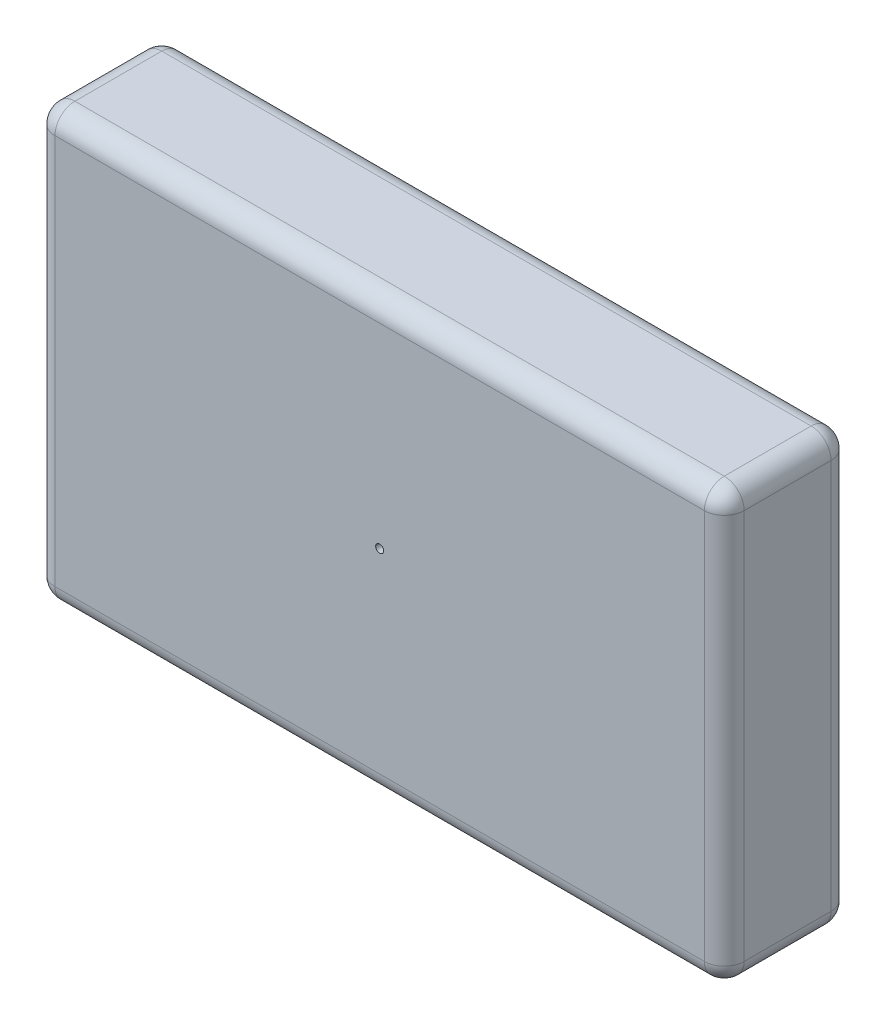
ISO-10303-21;
HEADER;
FILE_DESCRIPTION(('STEP AP214'),'2;1');
FILE_NAME('part.step','',(''),(''),'','','');
FILE_SCHEMA(('AUTOMOTIVE_DESIGN { 1 0 10303 214 1 1 1 1 }'));
ENDSEC;
DATA;
#1=APPLICATION_CONTEXT('core data for automotive mechanical design processes');
#2=APPLICATION_PROTOCOL_DEFINITION('international standard','automotive_design',2000,#1);
#3=PRODUCT_CONTEXT('',#1,'mechanical');
#4=PRODUCT('Part','Part','',(#3));
#5=PRODUCT_RELATED_PRODUCT_CATEGORY('part','',(#4));
#6=PRODUCT_DEFINITION_FORMATION('','',#4);
#7=PRODUCT_DEFINITION_CONTEXT('part definition',#1,'design');
#8=PRODUCT_DEFINITION('design','',#6,#7);
#9=PRODUCT_DEFINITION_SHAPE('','',#8);
#10=(LENGTH_UNIT() NAMED_UNIT(*) SI_UNIT(.MILLI.,.METRE.));
#11=(NAMED_UNIT(*) PLANE_ANGLE_UNIT() SI_UNIT($,.RADIAN.));
#12=(NAMED_UNIT(*) SI_UNIT($,.STERADIAN.) SOLID_ANGLE_UNIT());
#13=UNCERTAINTY_MEASURE_WITH_UNIT(LENGTH_MEASURE(1.E-05),#10,'distance_accuracy_value','');
#14=(GEOMETRIC_REPRESENTATION_CONTEXT(3) GLOBAL_UNCERTAINTY_ASSIGNED_CONTEXT((#13)) GLOBAL_UNIT_ASSIGNED_CONTEXT((#10,
#11,#12)) REPRESENTATION_CONTEXT('',''));
#15=CARTESIAN_POINT('',(0.,0.,0.));
#16=DIRECTION('',(0.,0.,1.));
#17=DIRECTION('',(1.,0.,0.));
#18=AXIS2_PLACEMENT_3D('',#15,#16,#17);
#19=CARTESIAN_POINT('',(0.,0.,21.8));
#20=DIRECTION('',(0.,0.,1.));
#21=DIRECTION('',(1.,0.,0.));
#22=AXIS2_PLACEMENT_3D('',#19,#20,#21);
#23=PLANE('',#22);
#24=CARTESIAN_POINT('',(0.,0.,21.8));
#25=DIRECTION('',(0.,0.,1.));
#26=DIRECTION('',(1.,0.,0.));
#27=AXIS2_PLACEMENT_3D('',#24,#25,#26);
#28=CIRCLE('',#27,1.);
#29=CARTESIAN_POINT('',(1.,0.,21.8));
#30=VERTEX_POINT('',#29);
#31=CARTESIAN_POINT('',(-1.,0.,21.8));
#32=VERTEX_POINT('',#31);
#33=EDGE_CURVE('E11',#30,#32,#28,.T.);
#34=ORIENTED_EDGE('',*,*,#33,.T.);
#35=CARTESIAN_POINT('',(0.,0.,21.8));
#36=DIRECTION('',(0.,0.,1.));
#37=DIRECTION('',(1.,0.,0.));
#38=AXIS2_PLACEMENT_3D('',#35,#36,#37);
#39=CIRCLE('',#38,1.);
#40=EDGE_CURVE('E381',#32,#30,#39,.T.);
#41=ORIENTED_EDGE('',*,*,#40,.T.);
#42=EDGE_LOOP('',(#34,#41));
#43=FACE_BOUND('',#42,.T.);
#44=ADVANCED_FACE('F17',(#43),#23,.T.);
#45=CARTESIAN_POINT('',(0.,0.,21.8));
#46=DIRECTION('',(0.,0.,1.));
#47=DIRECTION('',(1.,0.,0.));
#48=AXIS2_PLACEMENT_3D('',#45,#46,#47);
#49=CYLINDRICAL_SURFACE('',#48,1.);
#50=DIRECTION('',(0.,0.,1.));
#51=VECTOR('',#50,1.);
#52=CARTESIAN_POINT('',(-1.,0.,21.8));
#53=LINE('',#52,#51);
#54=CARTESIAN_POINT('',(-1.,0.,31.8));
#55=VERTEX_POINT('',#54);
#56=EDGE_CURVE('E379',#32,#55,#53,.T.);
#57=ORIENTED_EDGE('',*,*,#56,.F.);
#58=ORIENTED_EDGE('',*,*,#33,.F.);
#59=DIRECTION('',(0.,0.,1.));
#60=VECTOR('',#59,1.);
#61=CARTESIAN_POINT('',(1.,0.,21.8));
#62=LINE('',#61,#60);
#63=CARTESIAN_POINT('',(1.,0.,31.8));
#64=VERTEX_POINT('',#63);
#65=EDGE_CURVE('E350',#30,#64,#62,.T.);
#66=ORIENTED_EDGE('',*,*,#65,.T.);
#67=CARTESIAN_POINT('',(0.,0.,31.8));
#68=DIRECTION('',(0.,0.,1.));
#69=DIRECTION('',(1.,0.,0.));
#70=AXIS2_PLACEMENT_3D('',#67,#68,#69);
#71=CIRCLE('',#70,1.);
#72=EDGE_CURVE('E135',#64,#55,#71,.T.);
#73=ORIENTED_EDGE('',*,*,#72,.T.);
#74=EDGE_LOOP('',(#57,#58,#66,#73));
#75=FACE_BOUND('',#74,.T.);
#76=ADVANCED_FACE('F464',(#75),#49,.F.);
#77=CARTESIAN_POINT('',(81.5,49.,26.8));
#78=DIRECTION('',(0.,1.,0.));
#79=DIRECTION('',(1.,0.,0.));
#80=AXIS2_PLACEMENT_3D('',#77,#78,#79);
#81=SPHERICAL_SURFACE('',#80,5.);
#82=CARTESIAN_POINT('',(81.5,49.,26.8));
#83=DIRECTION('',(0.,0.,1.));
#84=DIRECTION('',(1.,0.,0.));
#85=AXIS2_PLACEMENT_3D('',#82,#83,#84);
#86=CIRCLE('',#85,5.);
#87=CARTESIAN_POINT('',(86.5,49.,26.8));
#88=VERTEX_POINT('',#87);
#89=CARTESIAN_POINT('',(81.5,54.,26.8));
#90=VERTEX_POINT('',#89);
#91=EDGE_CURVE('E20',#88,#90,#86,.T.);
#92=ORIENTED_EDGE('',*,*,#91,.T.);
#93=CARTESIAN_POINT('',(81.5,49.,26.8));
#94=DIRECTION('',(-1.,0.,0.));
#95=DIRECTION('',(0.,0.,-1.));
#96=AXIS2_PLACEMENT_3D('',#93,#94,#95);
#97=CIRCLE('',#96,5.);
#98=CARTESIAN_POINT('',(81.5,49.,31.8));
#99=VERTEX_POINT('',#98);
#100=EDGE_CURVE('E154',#99,#90,#97,.T.);
#101=ORIENTED_EDGE('',*,*,#100,.F.);
#102=CARTESIAN_POINT('',(81.5,49.,26.8));
#103=DIRECTION('',(0.,-1.,0.));
#104=DIRECTION('',(0.,0.,-1.));
#105=AXIS2_PLACEMENT_3D('',#102,#103,#104);
#106=CIRCLE('',#105,5.);
#107=EDGE_CURVE('E170',#88,#99,#106,.T.);
#108=ORIENTED_EDGE('',*,*,#107,.F.);
#109=EDGE_LOOP('',(#92,#101,#108));
#110=FACE_BOUND('',#109,.T.);
#111=ADVANCED_FACE('F231',(#110),#81,.T.);
#112=CARTESIAN_POINT('',(81.5,49.,31.8));
#113=DIRECTION('',(0.,0.,-1.));
#114=DIRECTION('',(-1.,0.,0.));
#115=AXIS2_PLACEMENT_3D('',#112,#113,#114);
#116=CYLINDRICAL_SURFACE('',#115,5.);
#117=CARTESIAN_POINT('',(81.5,49.,5.));
#118=DIRECTION('',(0.,0.,1.));
#119=DIRECTION('',(1.,0.,0.));
#120=AXIS2_PLACEMENT_3D('',#117,#118,#119);
#121=CIRCLE('',#120,5.);
#122=CARTESIAN_POINT('',(86.5,49.,5.));
#123=VERTEX_POINT('',#122);
#124=CARTESIAN_POINT('',(81.5,54.,5.));
#125=VERTEX_POINT('',#124);
#126=EDGE_CURVE('E211',#123,#125,#121,.T.);
#127=ORIENTED_EDGE('',*,*,#126,.T.);
#128=DIRECTION('',(0.,0.,-1.));
#129=VECTOR('',#128,1.);
#130=CARTESIAN_POINT('',(81.5,54.,31.8));
#131=LINE('',#130,#129);
#132=EDGE_CURVE('E248',#90,#125,#131,.T.);
#133=ORIENTED_EDGE('',*,*,#132,.F.);
#134=ORIENTED_EDGE('',*,*,#91,.F.);
#135=DIRECTION('',(0.,0.,1.));
#136=VECTOR('',#135,1.);
#137=CARTESIAN_POINT('',(86.5,49.,31.8));
#138=LINE('',#137,#136);
#139=EDGE_CURVE('E269',#123,#88,#138,.T.);
#140=ORIENTED_EDGE('',*,*,#139,.F.);
#141=EDGE_LOOP('',(#127,#133,#134,#140));
#142=FACE_BOUND('',#141,.T.);
#143=ADVANCED_FACE('F249',(#142),#116,.T.);
#144=CARTESIAN_POINT('',(81.5,49.,5.));
#145=DIRECTION('',(0.,1.,0.));
#146=DIRECTION('',(1.,0.,0.));
#147=AXIS2_PLACEMENT_3D('',#144,#145,#146);
#148=SPHERICAL_SURFACE('',#147,5.);
#149=CARTESIAN_POINT('',(81.5,49.,5.));
#150=DIRECTION('',(0.,-1.,0.));
#151=DIRECTION('',(0.,0.,1.));
#152=AXIS2_PLACEMENT_3D('',#149,#150,#151);
#153=CIRCLE('',#152,5.);
#154=CARTESIAN_POINT('',(81.5,49.,0.));
#155=VERTEX_POINT('',#154);
#156=EDGE_CURVE('E105',#155,#123,#153,.T.);
#157=ORIENTED_EDGE('',*,*,#156,.F.);
#158=CARTESIAN_POINT('',(81.5,49.,5.));
#159=DIRECTION('',(-1.,0.,0.));
#160=DIRECTION('',(0.,0.,1.));
#161=AXIS2_PLACEMENT_3D('',#158,#159,#160);
#162=CIRCLE('',#161,5.);
#163=EDGE_CURVE('E53',#125,#155,#162,.T.);
#164=ORIENTED_EDGE('',*,*,#163,.F.);
#165=ORIENTED_EDGE('',*,*,#126,.F.);
#166=EDGE_LOOP('',(#157,#164,#165));
#167=FACE_BOUND('',#166,.T.);
#168=ADVANCED_FACE('F489',(#167),#148,.T.);
#169=CARTESIAN_POINT('',(-81.5,49.,26.8));
#170=DIRECTION('',(0.,1.,0.));
#171=DIRECTION('',(1.,0.,0.));
#172=AXIS2_PLACEMENT_3D('',#169,#170,#171);
#173=SPHERICAL_SURFACE('',#172,5.);
#174=CARTESIAN_POINT('',(-81.5,49.,26.8));
#175=DIRECTION('',(0.,-1.,0.));
#176=DIRECTION('',(-1.,0.,0.));
#177=AXIS2_PLACEMENT_3D('',#174,#175,#176);
#178=CIRCLE('',#177,5.);
#179=CARTESIAN_POINT('',(-81.5,49.,31.8));
#180=VERTEX_POINT('',#179);
#181=CARTESIAN_POINT('',(-86.5,49.,26.8));
#182=VERTEX_POINT('',#181);
#183=EDGE_CURVE('E162',#180,#182,#178,.T.);
#184=ORIENTED_EDGE('',*,*,#183,.F.);
#185=CARTESIAN_POINT('',(-81.5,49.,26.8));
#186=DIRECTION('',(1.,0.,0.));
#187=DIRECTION('',(0.,0.,-1.));
#188=AXIS2_PLACEMENT_3D('',#185,#186,#187);
#189=CIRCLE('',#188,5.);
#190=CARTESIAN_POINT('',(-81.5,54.,26.8));
#191=VERTEX_POINT('',#190);
#192=EDGE_CURVE('E128',#191,#180,#189,.T.);
#193=ORIENTED_EDGE('',*,*,#192,.F.);
#194=CARTESIAN_POINT('',(-81.5,49.,26.8));
#195=DIRECTION('',(0.,0.,1.));
#196=DIRECTION('',(1.,0.,0.));
#197=AXIS2_PLACEMENT_3D('',#194,#195,#196);
#198=CIRCLE('',#197,5.);
#199=EDGE_CURVE('E208',#191,#182,#198,.T.);
#200=ORIENTED_EDGE('',*,*,#199,.T.);
#201=EDGE_LOOP('',(#184,#193,#200));
#202=FACE_BOUND('',#201,.T.);
#203=ADVANCED_FACE('F486',(#202),#173,.T.);
#204=CARTESIAN_POINT('',(-81.5,49.,31.8));
#205=DIRECTION('',(0.,0.,-1.));
#206=DIRECTION('',(-1.,0.,0.));
#207=AXIS2_PLACEMENT_3D('',#204,#205,#206);
#208=CYLINDRICAL_SURFACE('',#207,5.);
#209=CARTESIAN_POINT('',(-81.5,49.,5.));
#210=DIRECTION('',(0.,0.,1.));
#211=DIRECTION('',(1.,0.,0.));
#212=AXIS2_PLACEMENT_3D('',#209,#210,#211);
#213=CIRCLE('',#212,5.);
#214=CARTESIAN_POINT('',(-81.5,54.,5.));
#215=VERTEX_POINT('',#214);
#216=CARTESIAN_POINT('',(-86.5,49.,5.));
#217=VERTEX_POINT('',#216);
#218=EDGE_CURVE('E204',#215,#217,#213,.T.);
#219=ORIENTED_EDGE('',*,*,#218,.T.);
#220=DIRECTION('',(0.,0.,-1.));
#221=VECTOR('',#220,1.);
#222=CARTESIAN_POINT('',(-86.5,49.,31.8));
#223=LINE('',#222,#221);
#224=EDGE_CURVE('E280',#182,#217,#223,.T.);
#225=ORIENTED_EDGE('',*,*,#224,.F.);
#226=ORIENTED_EDGE('',*,*,#199,.F.);
#227=DIRECTION('',(0.,0.,1.));
#228=VECTOR('',#227,1.);
#229=CARTESIAN_POINT('',(-81.5,54.,31.8));
#230=LINE('',#229,#228);
#231=EDGE_CURVE('E257',#215,#191,#230,.T.);
#232=ORIENTED_EDGE('',*,*,#231,.F.);
#233=EDGE_LOOP('',(#219,#225,#226,#232));
#234=FACE_BOUND('',#233,.T.);
#235=ADVANCED_FACE('F482',(#234),#208,.T.);
#236=CARTESIAN_POINT('',(-81.5,49.,5.));
#237=DIRECTION('',(0.,1.,0.));
#238=DIRECTION('',(1.,0.,0.));
#239=AXIS2_PLACEMENT_3D('',#236,#237,#238);
#240=SPHERICAL_SURFACE('',#239,5.);
#241=CARTESIAN_POINT('',(-81.5,49.,5.));
#242=DIRECTION('',(1.,0.,0.));
#243=DIRECTION('',(0.,0.,1.));
#244=AXIS2_PLACEMENT_3D('',#241,#242,#243);
#245=CIRCLE('',#244,5.);
#246=CARTESIAN_POINT('',(-81.5,49.,0.));
#247=VERTEX_POINT('',#246);
#248=EDGE_CURVE('E186',#247,#215,#245,.T.);
#249=ORIENTED_EDGE('',*,*,#248,.F.);
#250=CARTESIAN_POINT('',(-81.5,49.,5.));
#251=DIRECTION('',(0.,-1.,0.));
#252=DIRECTION('',(1.,0.,0.));
#253=AXIS2_PLACEMENT_3D('',#250,#251,#252);
#254=CIRCLE('',#253,5.);
#255=EDGE_CURVE('E104',#217,#247,#254,.T.);
#256=ORIENTED_EDGE('',*,*,#255,.F.);
#257=ORIENTED_EDGE('',*,*,#218,.F.);
#258=EDGE_LOOP('',(#249,#256,#257));
#259=FACE_BOUND('',#258,.T.);
#260=ADVANCED_FACE('F479',(#259),#240,.T.);
#261=CARTESIAN_POINT('',(81.5,-49.,26.8));
#262=DIRECTION('',(0.,1.,0.));
#263=DIRECTION('',(1.,0.,0.));
#264=AXIS2_PLACEMENT_3D('',#261,#262,#263);
#265=SPHERICAL_SURFACE('',#264,5.);
#266=CARTESIAN_POINT('',(81.5,-49.,26.8));
#267=DIRECTION('',(0.,0.,1.));
#268=DIRECTION('',(1.,0.,0.));
#269=AXIS2_PLACEMENT_3D('',#266,#267,#268);
#270=CIRCLE('',#269,5.);
#271=CARTESIAN_POINT('',(81.5,-54.,26.8));
#272=VERTEX_POINT('',#271);
#273=CARTESIAN_POINT('',(86.5,-49.,26.8));
#274=VERTEX_POINT('',#273);
#275=EDGE_CURVE('E200',#272,#274,#270,.T.);
#276=ORIENTED_EDGE('',*,*,#275,.T.);
#277=CARTESIAN_POINT('',(81.5,-49.,26.8));
#278=DIRECTION('',(0.,1.,0.));
#279=DIRECTION('',(0.,0.,-1.));
#280=AXIS2_PLACEMENT_3D('',#277,#278,#279);
#281=CIRCLE('',#280,5.);
#282=CARTESIAN_POINT('',(81.5,-49.,31.8));
#283=VERTEX_POINT('',#282);
#284=EDGE_CURVE('E166',#283,#274,#281,.T.);
#285=ORIENTED_EDGE('',*,*,#284,.F.);
#286=CARTESIAN_POINT('',(81.5,-49.,26.8));
#287=DIRECTION('',(-1.,0.,0.));
#288=DIRECTION('',(0.,0.,1.));
#289=AXIS2_PLACEMENT_3D('',#286,#287,#288);
#290=CIRCLE('',#289,5.);
#291=EDGE_CURVE('E119',#272,#283,#290,.T.);
#292=ORIENTED_EDGE('',*,*,#291,.F.);
#293=EDGE_LOOP('',(#276,#285,#292));
#294=FACE_BOUND('',#293,.T.);
#295=ADVANCED_FACE('F334',(#294),#265,.T.);
#296=CARTESIAN_POINT('',(81.5,-49.,31.8));
#297=DIRECTION('',(0.,0.,-1.));
#298=DIRECTION('',(-1.,0.,0.));
#299=AXIS2_PLACEMENT_3D('',#296,#297,#298);
#300=CYLINDRICAL_SURFACE('',#299,5.);
#301=CARTESIAN_POINT('',(81.5,-49.,5.));
#302=DIRECTION('',(0.,0.,1.));
#303=DIRECTION('',(1.,0.,0.));
#304=AXIS2_PLACEMENT_3D('',#301,#302,#303);
#305=CIRCLE('',#304,5.);
#306=CARTESIAN_POINT('',(81.5,-54.,5.));
#307=VERTEX_POINT('',#306);
#308=CARTESIAN_POINT('',(86.5,-49.,5.));
#309=VERTEX_POINT('',#308);
#310=EDGE_CURVE('E196',#307,#309,#305,.T.);
#311=ORIENTED_EDGE('',*,*,#310,.T.);
#312=DIRECTION('',(0.,0.,-1.));
#313=VECTOR('',#312,1.);
#314=CARTESIAN_POINT('',(86.5,-49.,31.8));
#315=LINE('',#314,#313);
#316=EDGE_CURVE('E349',#274,#309,#315,.T.);
#317=ORIENTED_EDGE('',*,*,#316,.F.);
#318=ORIENTED_EDGE('',*,*,#275,.F.);
#319=DIRECTION('',(0.,0.,1.));
#320=VECTOR('',#319,1.);
#321=CARTESIAN_POINT('',(81.5,-54.,31.8));
#322=LINE('',#321,#320);
#323=EDGE_CURVE('E295',#307,#272,#322,.T.);
#324=ORIENTED_EDGE('',*,*,#323,.F.);
#325=EDGE_LOOP('',(#311,#317,#318,#324));
#326=FACE_BOUND('',#325,.T.);
#327=ADVANCED_FACE('F446',(#326),#300,.T.);
#328=CARTESIAN_POINT('',(81.5,-49.,5.));
#329=DIRECTION('',(0.,1.,0.));
#330=DIRECTION('',(1.,0.,0.));
#331=AXIS2_PLACEMENT_3D('',#328,#329,#330);
#332=SPHERICAL_SURFACE('',#331,5.);
#333=CARTESIAN_POINT('',(81.5,-49.,5.));
#334=DIRECTION('',(-1.,0.,0.));
#335=DIRECTION('',(0.,0.,-1.));
#336=AXIS2_PLACEMENT_3D('',#333,#334,#335);
#337=CIRCLE('',#336,5.);
#338=CARTESIAN_POINT('',(81.5,-49.,0.));
#339=VERTEX_POINT('',#338);
#340=EDGE_CURVE('E118',#339,#307,#337,.T.);
#341=ORIENTED_EDGE('',*,*,#340,.F.);
#342=CARTESIAN_POINT('',(81.5,-49.,5.));
#343=DIRECTION('',(0.,1.,0.));
#344=DIRECTION('',(0.,0.,1.));
#345=AXIS2_PLACEMENT_3D('',#342,#343,#344);
#346=CIRCLE('',#345,5.);
#347=EDGE_CURVE('E39',#309,#339,#346,.T.);
#348=ORIENTED_EDGE('',*,*,#347,.F.);
#349=ORIENTED_EDGE('',*,*,#310,.F.);
#350=EDGE_LOOP('',(#341,#348,#349));
#351=FACE_BOUND('',#350,.T.);
#352=ADVANCED_FACE('F448',(#351),#332,.T.);
#353=CARTESIAN_POINT('',(-81.5,-49.,26.8));
#354=DIRECTION('',(0.,1.,0.));
#355=DIRECTION('',(1.,0.,0.));
#356=AXIS2_PLACEMENT_3D('',#353,#354,#355);
#357=SPHERICAL_SURFACE('',#356,5.);
#358=CARTESIAN_POINT('',(-81.5,-49.,26.8));
#359=DIRECTION('',(1.,0.,0.));
#360=DIRECTION('',(0.,0.,1.));
#361=AXIS2_PLACEMENT_3D('',#358,#359,#360);
#362=CIRCLE('',#361,5.);
#363=CARTESIAN_POINT('',(-81.5,-49.,31.8));
#364=VERTEX_POINT('',#363);
#365=CARTESIAN_POINT('',(-81.5,-54.,26.8));
#366=VERTEX_POINT('',#365);
#367=EDGE_CURVE('E173',#364,#366,#362,.T.);
#368=ORIENTED_EDGE('',*,*,#367,.F.);
#369=CARTESIAN_POINT('',(-81.5,-49.,26.8));
#370=DIRECTION('',(0.,1.,0.));
#371=DIRECTION('',(-1.,0.,0.));
#372=AXIS2_PLACEMENT_3D('',#369,#370,#371);
#373=CIRCLE('',#372,5.);
#374=CARTESIAN_POINT('',(-86.5,-49.,26.8));
#375=VERTEX_POINT('',#374);
#376=EDGE_CURVE('E158',#375,#364,#373,.T.);
#377=ORIENTED_EDGE('',*,*,#376,.F.);
#378=CARTESIAN_POINT('',(-81.5,-49.,26.8));
#379=DIRECTION('',(0.,0.,1.));
#380=DIRECTION('',(1.,0.,0.));
#381=AXIS2_PLACEMENT_3D('',#378,#379,#380);
#382=CIRCLE('',#381,5.);
#383=EDGE_CURVE('E192',#375,#366,#382,.T.);
#384=ORIENTED_EDGE('',*,*,#383,.T.);
#385=EDGE_LOOP('',(#368,#377,#384));
#386=FACE_BOUND('',#385,.T.);
#387=ADVANCED_FACE('F441',(#386),#357,.T.);
#388=CARTESIAN_POINT('',(-81.5,-49.,31.8));
#389=DIRECTION('',(0.,0.,-1.));
#390=DIRECTION('',(-1.,0.,0.));
#391=AXIS2_PLACEMENT_3D('',#388,#389,#390);
#392=CYLINDRICAL_SURFACE('',#391,5.);
#393=CARTESIAN_POINT('',(-81.5,-49.,5.));
#394=DIRECTION('',(0.,0.,1.));
#395=DIRECTION('',(1.,0.,0.));
#396=AXIS2_PLACEMENT_3D('',#393,#394,#395);
#397=CIRCLE('',#396,5.);
#398=CARTESIAN_POINT('',(-86.5,-49.,5.));
#399=VERTEX_POINT('',#398);
#400=CARTESIAN_POINT('',(-81.5,-54.,5.));
#401=VERTEX_POINT('',#400);
#402=EDGE_CURVE('E98',#399,#401,#397,.T.);
#403=ORIENTED_EDGE('',*,*,#402,.T.);
#404=DIRECTION('',(0.,0.,-1.));
#405=VECTOR('',#404,1.);
#406=CARTESIAN_POINT('',(-81.5,-54.,31.8));
#407=LINE('',#406,#405);
#408=EDGE_CURVE('E288',#366,#401,#407,.T.);
#409=ORIENTED_EDGE('',*,*,#408,.F.);
#410=ORIENTED_EDGE('',*,*,#383,.F.);
#411=DIRECTION('',(0.,0.,1.));
#412=VECTOR('',#411,1.);
#413=CARTESIAN_POINT('',(-86.5,-49.,31.8));
#414=LINE('',#413,#412);
#415=EDGE_CURVE('E273',#399,#375,#414,.T.);
#416=ORIENTED_EDGE('',*,*,#415,.F.);
#417=EDGE_LOOP('',(#403,#409,#410,#416));
#418=FACE_BOUND('',#417,.T.);
#419=ADVANCED_FACE('F443',(#418),#392,.T.);
#420=CARTESIAN_POINT('',(-81.5,-49.,5.));
#421=DIRECTION('',(0.,1.,0.));
#422=DIRECTION('',(1.,0.,0.));
#423=AXIS2_PLACEMENT_3D('',#420,#421,#422);
#424=SPHERICAL_SURFACE('',#423,5.);
#425=CARTESIAN_POINT('',(-81.5,-49.,5.));
#426=DIRECTION('',(0.,1.,0.));
#427=DIRECTION('',(1.,0.,0.));
#428=AXIS2_PLACEMENT_3D('',#425,#426,#427);
#429=CIRCLE('',#428,5.);
#430=CARTESIAN_POINT('',(-81.5,-49.,0.));
#431=VERTEX_POINT('',#430);
#432=EDGE_CURVE('E92',#431,#399,#429,.T.);
#433=ORIENTED_EDGE('',*,*,#432,.F.);
#434=CARTESIAN_POINT('',(-81.5,-49.,5.));
#435=DIRECTION('',(1.,0.,0.));
#436=DIRECTION('',(0.,0.,-1.));
#437=AXIS2_PLACEMENT_3D('',#434,#435,#436);
#438=CIRCLE('',#437,5.);
#439=EDGE_CURVE('E95',#401,#431,#438,.T.);
#440=ORIENTED_EDGE('',*,*,#439,.F.);
#441=ORIENTED_EDGE('',*,*,#402,.F.);
#442=EDGE_LOOP('',(#433,#440,#441));
#443=FACE_BOUND('',#442,.T.);
#444=ADVANCED_FACE('F94',(#443),#424,.T.);
#445=CARTESIAN_POINT('',(-86.5,49.,5.));
#446=DIRECTION('',(-1.,0.,0.));
#447=DIRECTION('',(0.,0.,1.));
#448=AXIS2_PLACEMENT_3D('',#445,#446,#447);
#449=CYLINDRICAL_SURFACE('',#448,5.);
#450=DIRECTION('',(1.,0.,0.));
#451=VECTOR('',#450,1.);
#452=CARTESIAN_POINT('',(0.,49.,0.));
#453=LINE('',#452,#451);
#454=EDGE_CURVE('E134',#247,#155,#453,.T.);
#455=ORIENTED_EDGE('',*,*,#454,.F.);
#456=ORIENTED_EDGE('',*,*,#248,.T.);
#457=DIRECTION('',(-1.,0.,0.));
#458=VECTOR('',#457,1.);
#459=CARTESIAN_POINT('',(-86.5,54.,5.));
#460=LINE('',#459,#458);
#461=EDGE_CURVE('E265',#125,#215,#460,.T.);
#462=ORIENTED_EDGE('',*,*,#461,.F.);
#463=ORIENTED_EDGE('',*,*,#163,.T.);
#464=EDGE_LOOP('',(#455,#456,#462,#463));
#465=FACE_BOUND('',#464,.T.);
#466=ADVANCED_FACE('F497',(#465),#449,.T.);
#467=CARTESIAN_POINT('',(-81.5,54.,5.));
#468=DIRECTION('',(0.,-1.,0.));
#469=DIRECTION('',(1.,0.,0.));
#470=AXIS2_PLACEMENT_3D('',#467,#468,#469);
#471=CYLINDRICAL_SURFACE('',#470,5.);
#472=DIRECTION('',(0.,1.,0.));
#473=VECTOR('',#472,1.);
#474=CARTESIAN_POINT('',(-81.5,0.,0.));
#475=LINE('',#474,#473);
#476=EDGE_CURVE('E125',#431,#247,#475,.T.);
#477=ORIENTED_EDGE('',*,*,#476,.F.);
#478=ORIENTED_EDGE('',*,*,#432,.T.);
#479=DIRECTION('',(0.,-1.,0.));
#480=VECTOR('',#479,1.);
#481=CARTESIAN_POINT('',(-86.5,54.,5.));
#482=LINE('',#481,#480);
#483=EDGE_CURVE('E253',#217,#399,#482,.T.);
#484=ORIENTED_EDGE('',*,*,#483,.F.);
#485=ORIENTED_EDGE('',*,*,#255,.T.);
#486=EDGE_LOOP('',(#477,#478,#484,#485));
#487=FACE_BOUND('',#486,.T.);
#488=ADVANCED_FACE('F131',(#487),#471,.T.);
#489=CARTESIAN_POINT('',(81.5,54.,5.));
#490=DIRECTION('',(0.,1.,0.));
#491=DIRECTION('',(0.,0.,1.));
#492=AXIS2_PLACEMENT_3D('',#489,#490,#491);
#493=CYLINDRICAL_SURFACE('',#492,5.);
#494=DIRECTION('',(0.,1.,0.));
#495=VECTOR('',#494,1.);
#496=CARTESIAN_POINT('',(86.5,54.,5.));
#497=LINE('',#496,#495);
#498=EDGE_CURVE('E356',#309,#123,#497,.T.);
#499=ORIENTED_EDGE('',*,*,#498,.F.);
#500=ORIENTED_EDGE('',*,*,#347,.T.);
#501=DIRECTION('',(0.,-1.,0.));
#502=VECTOR('',#501,1.);
#503=CARTESIAN_POINT('',(81.5,0.,0.));
#504=LINE('',#503,#502);
#505=EDGE_CURVE('E126',#155,#339,#504,.T.);
#506=ORIENTED_EDGE('',*,*,#505,.F.);
#507=ORIENTED_EDGE('',*,*,#156,.T.);
#508=EDGE_LOOP('',(#499,#500,#506,#507));
#509=FACE_BOUND('',#508,.T.);
#510=ADVANCED_FACE('F449',(#509),#493,.T.);
#511=CARTESIAN_POINT('',(-86.5,-49.,5.));
#512=DIRECTION('',(1.,0.,0.));
#513=DIRECTION('',(0.,0.,-1.));
#514=AXIS2_PLACEMENT_3D('',#511,#512,#513);
#515=CYLINDRICAL_SURFACE('',#514,5.);
#516=DIRECTION('',(1.,0.,0.));
#517=VECTOR('',#516,1.);
#518=CARTESIAN_POINT('',(-86.5,-54.,5.));
#519=LINE('',#518,#517);
#520=EDGE_CURVE('E115',#401,#307,#519,.T.);
#521=ORIENTED_EDGE('',*,*,#520,.F.);
#522=ORIENTED_EDGE('',*,*,#439,.T.);
#523=DIRECTION('',(-1.,0.,0.));
#524=VECTOR('',#523,1.);
#525=CARTESIAN_POINT('',(0.,-49.,0.));
#526=LINE('',#525,#524);
#527=EDGE_CURVE('E112',#339,#431,#526,.T.);
#528=ORIENTED_EDGE('',*,*,#527,.F.);
#529=ORIENTED_EDGE('',*,*,#340,.T.);
#530=EDGE_LOOP('',(#521,#522,#528,#529));
#531=FACE_BOUND('',#530,.T.);
#532=ADVANCED_FACE('F110',(#531),#515,.T.);
#533=CARTESIAN_POINT('',(0.,-49.,26.8));
#534=DIRECTION('',(-1.,0.,0.));
#535=DIRECTION('',(0.,0.,1.));
#536=AXIS2_PLACEMENT_3D('',#533,#534,#535);
#537=CYLINDRICAL_SURFACE('',#536,5.);
#538=DIRECTION('',(1.,0.,0.));
#539=VECTOR('',#538,1.);
#540=CARTESIAN_POINT('',(86.5,-49.,31.8));
#541=LINE('',#540,#539);
#542=EDGE_CURVE('E303',#364,#283,#541,.T.);
#543=ORIENTED_EDGE('',*,*,#542,.F.);
#544=ORIENTED_EDGE('',*,*,#367,.T.);
#545=DIRECTION('',(-1.,0.,0.));
#546=VECTOR('',#545,1.);
#547=CARTESIAN_POINT('',(-86.5,-54.,26.8));
#548=LINE('',#547,#546);
#549=EDGE_CURVE('E284',#272,#366,#548,.T.);
#550=ORIENTED_EDGE('',*,*,#549,.F.);
#551=ORIENTED_EDGE('',*,*,#291,.T.);
#552=EDGE_LOOP('',(#543,#544,#550,#551));
#553=FACE_BOUND('',#552,.T.);
#554=ADVANCED_FACE('F327',(#553),#537,.T.);
#555=CARTESIAN_POINT('',(81.5,0.,26.8));
#556=DIRECTION('',(0.,-1.,0.));
#557=DIRECTION('',(0.,0.,-1.));
#558=AXIS2_PLACEMENT_3D('',#555,#556,#557);
#559=CYLINDRICAL_SURFACE('',#558,5.);
#560=DIRECTION('',(0.,1.,0.));
#561=VECTOR('',#560,1.);
#562=CARTESIAN_POINT('',(81.5,54.,31.8));
#563=LINE('',#562,#561);
#564=EDGE_CURVE('E306',#283,#99,#563,.T.);
#565=ORIENTED_EDGE('',*,*,#564,.F.);
#566=ORIENTED_EDGE('',*,*,#284,.T.);
#567=DIRECTION('',(0.,-1.,0.));
#568=VECTOR('',#567,1.);
#569=CARTESIAN_POINT('',(86.5,-54.,26.8));
#570=LINE('',#569,#568);
#571=EDGE_CURVE('E342',#88,#274,#570,.T.);
#572=ORIENTED_EDGE('',*,*,#571,.F.);
#573=ORIENTED_EDGE('',*,*,#107,.T.);
#574=EDGE_LOOP('',(#565,#566,#572,#573));
#575=FACE_BOUND('',#574,.T.);
#576=ADVANCED_FACE('F340',(#575),#559,.T.);
#577=CARTESIAN_POINT('',(-81.5,0.,26.8));
#578=DIRECTION('',(0.,1.,0.));
#579=DIRECTION('',(-1.,0.,0.));
#580=AXIS2_PLACEMENT_3D('',#577,#578,#579);
#581=CYLINDRICAL_SURFACE('',#580,5.);
#582=DIRECTION('',(0.,1.,0.));
#583=VECTOR('',#582,1.);
#584=CARTESIAN_POINT('',(-86.5,54.,26.8));
#585=LINE('',#584,#583);
#586=EDGE_CURVE('E276',#375,#182,#585,.T.);
#587=ORIENTED_EDGE('',*,*,#586,.F.);
#588=ORIENTED_EDGE('',*,*,#376,.T.);
#589=DIRECTION('',(0.,-1.,0.));
#590=VECTOR('',#589,1.);
#591=CARTESIAN_POINT('',(-81.5,-54.,31.8));
#592=LINE('',#591,#590);
#593=EDGE_CURVE('E299',#180,#364,#592,.T.);
#594=ORIENTED_EDGE('',*,*,#593,.F.);
#595=ORIENTED_EDGE('',*,*,#183,.T.);
#596=EDGE_LOOP('',(#587,#588,#594,#595));
#597=FACE_BOUND('',#596,.T.);
#598=ADVANCED_FACE('F318',(#597),#581,.T.);
#599=CARTESIAN_POINT('',(0.,49.,26.8));
#600=DIRECTION('',(1.,0.,0.));
#601=DIRECTION('',(0.,0.,-1.));
#602=AXIS2_PLACEMENT_3D('',#599,#600,#601);
#603=CYLINDRICAL_SURFACE('',#602,5.);
#604=DIRECTION('',(1.,0.,0.));
#605=VECTOR('',#604,1.);
#606=CARTESIAN_POINT('',(86.5,54.,26.8));
#607=LINE('',#606,#605);
#608=EDGE_CURVE('E243',#191,#90,#607,.T.);
#609=ORIENTED_EDGE('',*,*,#608,.F.);
#610=ORIENTED_EDGE('',*,*,#192,.T.);
#611=DIRECTION('',(-1.,0.,0.));
#612=VECTOR('',#611,1.);
#613=CARTESIAN_POINT('',(-86.5,49.,31.8));
#614=LINE('',#613,#612);
#615=EDGE_CURVE('E145',#99,#180,#614,.T.);
#616=ORIENTED_EDGE('',*,*,#615,.F.);
#617=ORIENTED_EDGE('',*,*,#100,.T.);
#618=EDGE_LOOP('',(#609,#610,#616,#617));
#619=FACE_BOUND('',#618,.T.);
#620=ADVANCED_FACE('F241',(#619),#603,.T.);
#621=CARTESIAN_POINT('',(0.,0.,0.));
#622=DIRECTION('',(0.,0.,1.));
#623=DIRECTION('',(1.,0.,0.));
#624=AXIS2_PLACEMENT_3D('',#621,#622,#623);
#625=PLANE('',#624);
#626=ORIENTED_EDGE('',*,*,#476,.T.);
#627=ORIENTED_EDGE('',*,*,#454,.T.);
#628=ORIENTED_EDGE('',*,*,#505,.T.);
#629=ORIENTED_EDGE('',*,*,#527,.T.);
#630=EDGE_LOOP('',(#626,#627,#628,#629));
#631=FACE_BOUND('',#630,.T.);
#632=ADVANCED_FACE('F123',(#631),#625,.F.);
#633=CARTESIAN_POINT('',(0.,0.,31.8));
#634=DIRECTION('',(0.,0.,1.));
#635=DIRECTION('',(1.,0.,0.));
#636=AXIS2_PLACEMENT_3D('',#633,#634,#635);
#637=PLANE('',#636);
#638=ORIENTED_EDGE('',*,*,#72,.F.);
#639=CARTESIAN_POINT('',(0.,0.,31.8));
#640=DIRECTION('',(0.,0.,1.));
#641=DIRECTION('',(1.,0.,0.));
#642=AXIS2_PLACEMENT_3D('',#639,#640,#641);
#643=CIRCLE('',#642,1.);
#644=EDGE_CURVE('E360',#55,#64,#643,.T.);
#645=ORIENTED_EDGE('',*,*,#644,.F.);
#646=EDGE_LOOP('',(#638,#645));
#647=FACE_BOUND('',#646,.T.);
#648=ORIENTED_EDGE('',*,*,#593,.T.);
#649=ORIENTED_EDGE('',*,*,#542,.T.);
#650=ORIENTED_EDGE('',*,*,#564,.T.);
#651=ORIENTED_EDGE('',*,*,#615,.T.);
#652=EDGE_LOOP('',(#648,#649,#650,#651));
#653=FACE_BOUND('',#652,.T.);
#654=ADVANCED_FACE('F315',(#647,#653),#637,.T.);
#655=CARTESIAN_POINT('',(-86.5,-54.,31.8));
#656=DIRECTION('',(0.,1.,0.));
#657=DIRECTION('',(1.,0.,0.));
#658=AXIS2_PLACEMENT_3D('',#655,#656,#657);
#659=PLANE('',#658);
#660=ORIENTED_EDGE('',*,*,#549,.T.);
#661=ORIENTED_EDGE('',*,*,#408,.T.);
#662=ORIENTED_EDGE('',*,*,#520,.T.);
#663=ORIENTED_EDGE('',*,*,#323,.T.);
#664=EDGE_LOOP('',(#660,#661,#662,#663));
#665=FACE_BOUND('',#664,.T.);
#666=ADVANCED_FACE('F445',(#665),#659,.F.);
#667=CARTESIAN_POINT('',(-86.5,54.,31.8));
#668=DIRECTION('',(1.,0.,0.));
#669=DIRECTION('',(0.,1.,0.));
#670=AXIS2_PLACEMENT_3D('',#667,#668,#669);
#671=PLANE('',#670);
#672=ORIENTED_EDGE('',*,*,#483,.T.);
#673=ORIENTED_EDGE('',*,*,#415,.T.);
#674=ORIENTED_EDGE('',*,*,#586,.T.);
#675=ORIENTED_EDGE('',*,*,#224,.T.);
#676=EDGE_LOOP('',(#672,#673,#674,#675));
#677=FACE_BOUND('',#676,.T.);
#678=ADVANCED_FACE('F459',(#677),#671,.F.);
#679=CARTESIAN_POINT('',(-86.5,54.,31.8));
#680=DIRECTION('',(0.,-1.,0.));
#681=DIRECTION('',(0.,0.,-1.));
#682=AXIS2_PLACEMENT_3D('',#679,#680,#681);
#683=PLANE('',#682);
#684=ORIENTED_EDGE('',*,*,#461,.T.);
#685=ORIENTED_EDGE('',*,*,#231,.T.);
#686=ORIENTED_EDGE('',*,*,#608,.T.);
#687=ORIENTED_EDGE('',*,*,#132,.T.);
#688=EDGE_LOOP('',(#684,#685,#686,#687));
#689=FACE_BOUND('',#688,.T.);
#690=ADVANCED_FACE('F255',(#689),#683,.F.);
#691=CARTESIAN_POINT('',(86.5,54.,31.8));
#692=DIRECTION('',(-1.,0.,0.));
#693=DIRECTION('',(0.,0.,1.));
#694=AXIS2_PLACEMENT_3D('',#691,#692,#693);
#695=PLANE('',#694);
#696=ORIENTED_EDGE('',*,*,#571,.T.);
#697=ORIENTED_EDGE('',*,*,#316,.T.);
#698=ORIENTED_EDGE('',*,*,#498,.T.);
#699=ORIENTED_EDGE('',*,*,#139,.T.);
#700=EDGE_LOOP('',(#696,#697,#698,#699));
#701=FACE_BOUND('',#700,.T.);
#702=ADVANCED_FACE('F450',(#701),#695,.F.);
#703=CARTESIAN_POINT('',(0.,0.,21.8));
#704=DIRECTION('',(0.,0.,1.));
#705=DIRECTION('',(1.,0.,0.));
#706=AXIS2_PLACEMENT_3D('',#703,#704,#705);
#707=CYLINDRICAL_SURFACE('',#706,1.);
#708=ORIENTED_EDGE('',*,*,#40,.F.);
#709=ORIENTED_EDGE('',*,*,#56,.T.);
#710=ORIENTED_EDGE('',*,*,#644,.T.);
#711=ORIENTED_EDGE('',*,*,#65,.F.);
#712=EDGE_LOOP('',(#708,#709,#710,#711));
#713=FACE_BOUND('',#712,.T.);
#714=ADVANCED_FACE('F398',(#713),#707,.F.);
#715=CLOSED_SHELL('',(#44,#76,#111,#143,#168,#203,#235,#260,#295,#327,#352,#387,#419,#444,#466,
#488,#510,#532,#554,#576,#598,#620,#632,#654,#666,#678,#690,#702,#714));
#716=MANIFOLD_SOLID_BREP('B1',#715);
#717=ADVANCED_BREP_SHAPE_REPRESENTATION('',(#18,#716),#14);
#718=SHAPE_DEFINITION_REPRESENTATION(#9,#717);
ENDSEC;
END-ISO-10303-21;
